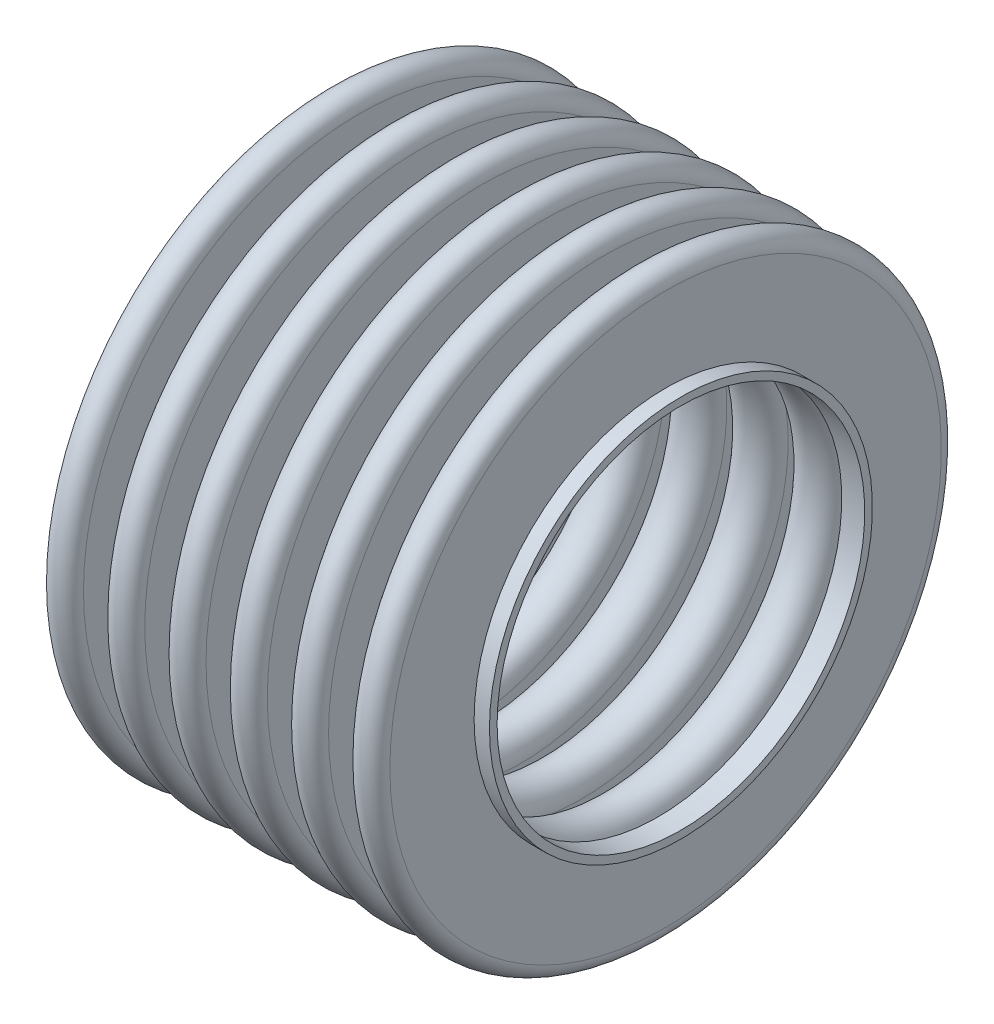
ISO-10303-21;
HEADER;
FILE_DESCRIPTION(('STEP AP214'),'2;1');
FILE_NAME('part.step','',(''),(''),'','','');
FILE_SCHEMA(('AUTOMOTIVE_DESIGN { 1 0 10303 214 1 1 1 1 }'));
ENDSEC;
DATA;
#1=APPLICATION_CONTEXT('core data for automotive mechanical design processes');
#2=APPLICATION_PROTOCOL_DEFINITION('international standard','automotive_design',2000,#1);
#3=PRODUCT_CONTEXT('',#1,'mechanical');
#4=PRODUCT('Part','Part','',(#3));
#5=PRODUCT_RELATED_PRODUCT_CATEGORY('part','',(#4));
#6=PRODUCT_DEFINITION_FORMATION('','',#4);
#7=PRODUCT_DEFINITION_CONTEXT('part definition',#1,'design');
#8=PRODUCT_DEFINITION('design','',#6,#7);
#9=PRODUCT_DEFINITION_SHAPE('','',#8);
#10=(LENGTH_UNIT() NAMED_UNIT(*) SI_UNIT(.MILLI.,.METRE.));
#11=(NAMED_UNIT(*) PLANE_ANGLE_UNIT() SI_UNIT($,.RADIAN.));
#12=(NAMED_UNIT(*) SI_UNIT($,.STERADIAN.) SOLID_ANGLE_UNIT());
#13=UNCERTAINTY_MEASURE_WITH_UNIT(LENGTH_MEASURE(1.E-05),#10,'distance_accuracy_value','');
#14=(GEOMETRIC_REPRESENTATION_CONTEXT(3) GLOBAL_UNCERTAINTY_ASSIGNED_CONTEXT((#13)) GLOBAL_UNIT_ASSIGNED_CONTEXT((#10,
#11,#12)) REPRESENTATION_CONTEXT('',''));
#15=CARTESIAN_POINT('',(0.,0.,0.));
#16=DIRECTION('',(0.,0.,1.));
#17=DIRECTION('',(1.,0.,0.));
#18=AXIS2_PLACEMENT_3D('',#15,#16,#17);
#19=CARTESIAN_POINT('',(22.,0.,0.));
#20=DIRECTION('',(-1.,0.,0.));
#21=DIRECTION('',(0.,0.,1.));
#22=AXIS2_PLACEMENT_3D('',#19,#20,#21);
#23=CYLINDRICAL_SURFACE('',#22,6.25);
#24=CARTESIAN_POINT('',(10.,0.,0.));
#25=DIRECTION('',(-1.,0.,0.));
#26=DIRECTION('',(0.,0.,1.));
#27=AXIS2_PLACEMENT_3D('',#24,#25,#26);
#28=CIRCLE('',#27,6.25);
#29=CARTESIAN_POINT('',(10.,0.,6.25));
#30=VERTEX_POINT('',#29);
#31=EDGE_CURVE('E191',#30,#30,#28,.T.);
#32=ORIENTED_EDGE('',*,*,#31,.F.);
#33=EDGE_LOOP('',(#32));
#34=FACE_BOUND('',#33,.T.);
#35=CARTESIAN_POINT('',(10.5,0.,0.));
#36=DIRECTION('',(-1.,0.,0.));
#37=DIRECTION('',(0.,0.,1.));
#38=AXIS2_PLACEMENT_3D('',#35,#36,#37);
#39=CIRCLE('',#38,6.25);
#40=CARTESIAN_POINT('',(10.5,0.,6.25));
#41=VERTEX_POINT('',#40);
#42=EDGE_CURVE('E10',#41,#41,#39,.T.);
#43=ORIENTED_EDGE('',*,*,#42,.T.);
#44=EDGE_LOOP('',(#43));
#45=FACE_BOUND('',#44,.T.);
#46=ADVANCED_FACE('F31',(#34,#45),#23,.T.);
#47=CARTESIAN_POINT('',(10.5,9.,0.));
#48=DIRECTION('',(1.,0.,0.));
#49=DIRECTION('',(0.,0.,-1.));
#50=AXIS2_PLACEMENT_3D('',#47,#48,#49);
#51=PLANE('',#50);
#52=ORIENTED_EDGE('',*,*,#42,.F.);
#53=EDGE_LOOP('',(#52));
#54=FACE_BOUND('',#53,.T.);
#55=CARTESIAN_POINT('',(10.5,0.,0.));
#56=DIRECTION('',(-1.,0.,0.));
#57=DIRECTION('',(0.,0.,1.));
#58=AXIS2_PLACEMENT_3D('',#55,#56,#57);
#59=CIRCLE('',#58,9.);
#60=CARTESIAN_POINT('',(10.5,0.,9.));
#61=VERTEX_POINT('',#60);
#62=EDGE_CURVE('E37',#61,#61,#59,.T.);
#63=ORIENTED_EDGE('',*,*,#62,.T.);
#64=EDGE_LOOP('',(#63));
#65=FACE_BOUND('',#64,.T.);
#66=ADVANCED_FACE('F198',(#54,#65),#51,.F.);
#67=CARTESIAN_POINT('',(11.,0.,0.));
#68=DIRECTION('',(-1.,0.,0.));
#69=DIRECTION('',(0.,0.,1.));
#70=AXIS2_PLACEMENT_3D('',#67,#68,#69);
#71=TOROIDAL_SURFACE('',#70,9.,0.5);
#72=ORIENTED_EDGE('',*,*,#62,.F.);
#73=EDGE_LOOP('',(#72));
#74=FACE_BOUND('',#73,.T.);
#75=CARTESIAN_POINT('',(11.5,0.,0.));
#76=DIRECTION('',(-1.,0.,0.));
#77=DIRECTION('',(0.,0.,1.));
#78=AXIS2_PLACEMENT_3D('',#75,#76,#77);
#79=CIRCLE('',#78,9.);
#80=CARTESIAN_POINT('',(11.5,0.,9.));
#81=VERTEX_POINT('',#80);
#82=EDGE_CURVE('E41',#81,#81,#79,.T.);
#83=ORIENTED_EDGE('',*,*,#82,.T.);
#84=EDGE_LOOP('',(#83));
#85=FACE_BOUND('',#84,.T.);
#86=ADVANCED_FACE('F202',(#74,#85),#71,.T.);
#87=CARTESIAN_POINT('',(11.5,6.75,0.));
#88=DIRECTION('',(-1.,0.,0.));
#89=DIRECTION('',(0.,0.,1.));
#90=AXIS2_PLACEMENT_3D('',#87,#88,#89);
#91=PLANE('',#90);
#92=ORIENTED_EDGE('',*,*,#82,.F.);
#93=EDGE_LOOP('',(#92));
#94=FACE_BOUND('',#93,.T.);
#95=CARTESIAN_POINT('',(11.5,0.,0.));
#96=DIRECTION('',(-1.,0.,0.));
#97=DIRECTION('',(0.,0.,1.));
#98=AXIS2_PLACEMENT_3D('',#95,#96,#97);
#99=CIRCLE('',#98,6.75);
#100=CARTESIAN_POINT('',(11.5,0.,6.75));
#101=VERTEX_POINT('',#100);
#102=EDGE_CURVE('E45',#101,#101,#99,.T.);
#103=ORIENTED_EDGE('',*,*,#102,.T.);
#104=EDGE_LOOP('',(#103));
#105=FACE_BOUND('',#104,.T.);
#106=ADVANCED_FACE('F207',(#94,#105),#91,.F.);
#107=CARTESIAN_POINT('',(12.,0.,0.));
#108=DIRECTION('',(-1.,0.,0.));
#109=DIRECTION('',(0.,0.,1.));
#110=AXIS2_PLACEMENT_3D('',#107,#108,#109);
#111=TOROIDAL_SURFACE('',#110,6.75,0.5);
#112=ORIENTED_EDGE('',*,*,#102,.F.);
#113=EDGE_LOOP('',(#112));
#114=FACE_BOUND('',#113,.T.);
#115=CARTESIAN_POINT('',(12.5,0.,0.));
#116=DIRECTION('',(-1.,0.,0.));
#117=DIRECTION('',(0.,0.,1.));
#118=AXIS2_PLACEMENT_3D('',#115,#116,#117);
#119=CIRCLE('',#118,6.75);
#120=CARTESIAN_POINT('',(12.5,0.,6.75));
#121=VERTEX_POINT('',#120);
#122=EDGE_CURVE('E50',#121,#121,#119,.T.);
#123=ORIENTED_EDGE('',*,*,#122,.T.);
#124=EDGE_LOOP('',(#123));
#125=FACE_BOUND('',#124,.T.);
#126=ADVANCED_FACE('F213',(#114,#125),#111,.F.);
#127=CARTESIAN_POINT('',(12.5,9.,0.));
#128=DIRECTION('',(1.,0.,0.));
#129=DIRECTION('',(0.,0.,-1.));
#130=AXIS2_PLACEMENT_3D('',#127,#128,#129);
#131=PLANE('',#130);
#132=ORIENTED_EDGE('',*,*,#122,.F.);
#133=EDGE_LOOP('',(#132));
#134=FACE_BOUND('',#133,.T.);
#135=CARTESIAN_POINT('',(12.5,0.,0.));
#136=DIRECTION('',(-1.,0.,0.));
#137=DIRECTION('',(0.,0.,1.));
#138=AXIS2_PLACEMENT_3D('',#135,#136,#137);
#139=CIRCLE('',#138,9.);
#140=CARTESIAN_POINT('',(12.5,0.,9.));
#141=VERTEX_POINT('',#140);
#142=EDGE_CURVE('E53',#141,#141,#139,.T.);
#143=ORIENTED_EDGE('',*,*,#142,.T.);
#144=EDGE_LOOP('',(#143));
#145=FACE_BOUND('',#144,.T.);
#146=ADVANCED_FACE('F217',(#134,#145),#131,.F.);
#147=CARTESIAN_POINT('',(13.,0.,0.));
#148=DIRECTION('',(-1.,0.,0.));
#149=DIRECTION('',(0.,0.,1.));
#150=AXIS2_PLACEMENT_3D('',#147,#148,#149);
#151=TOROIDAL_SURFACE('',#150,9.,0.5);
#152=ORIENTED_EDGE('',*,*,#142,.F.);
#153=EDGE_LOOP('',(#152));
#154=FACE_BOUND('',#153,.T.);
#155=CARTESIAN_POINT('',(13.5,0.,0.));
#156=DIRECTION('',(-1.,0.,0.));
#157=DIRECTION('',(0.,0.,1.));
#158=AXIS2_PLACEMENT_3D('',#155,#156,#157);
#159=CIRCLE('',#158,9.);
#160=CARTESIAN_POINT('',(13.5,0.,9.));
#161=VERTEX_POINT('',#160);
#162=EDGE_CURVE('E56',#161,#161,#159,.T.);
#163=ORIENTED_EDGE('',*,*,#162,.T.);
#164=EDGE_LOOP('',(#163));
#165=FACE_BOUND('',#164,.T.);
#166=ADVANCED_FACE('F221',(#154,#165),#151,.T.);
#167=CARTESIAN_POINT('',(13.5,6.75,0.));
#168=DIRECTION('',(-1.,0.,0.));
#169=DIRECTION('',(0.,0.,1.));
#170=AXIS2_PLACEMENT_3D('',#167,#168,#169);
#171=PLANE('',#170);
#172=ORIENTED_EDGE('',*,*,#162,.F.);
#173=EDGE_LOOP('',(#172));
#174=FACE_BOUND('',#173,.T.);
#175=CARTESIAN_POINT('',(13.5,0.,0.));
#176=DIRECTION('',(-1.,0.,0.));
#177=DIRECTION('',(0.,0.,1.));
#178=AXIS2_PLACEMENT_3D('',#175,#176,#177);
#179=CIRCLE('',#178,6.75);
#180=CARTESIAN_POINT('',(13.5,0.,6.75));
#181=VERTEX_POINT('',#180);
#182=EDGE_CURVE('E59',#181,#181,#179,.T.);
#183=ORIENTED_EDGE('',*,*,#182,.T.);
#184=EDGE_LOOP('',(#183));
#185=FACE_BOUND('',#184,.T.);
#186=ADVANCED_FACE('F225',(#174,#185),#171,.F.);
#187=CARTESIAN_POINT('',(14.,0.,0.));
#188=DIRECTION('',(-1.,0.,0.));
#189=DIRECTION('',(0.,0.,1.));
#190=AXIS2_PLACEMENT_3D('',#187,#188,#189);
#191=TOROIDAL_SURFACE('',#190,6.75,0.5);
#192=ORIENTED_EDGE('',*,*,#182,.F.);
#193=EDGE_LOOP('',(#192));
#194=FACE_BOUND('',#193,.T.);
#195=CARTESIAN_POINT('',(14.5,0.,0.));
#196=DIRECTION('',(-1.,0.,0.));
#197=DIRECTION('',(0.,0.,1.));
#198=AXIS2_PLACEMENT_3D('',#195,#196,#197);
#199=CIRCLE('',#198,6.75);
#200=CARTESIAN_POINT('',(14.5,0.,6.75));
#201=VERTEX_POINT('',#200);
#202=EDGE_CURVE('E62',#201,#201,#199,.T.);
#203=ORIENTED_EDGE('',*,*,#202,.T.);
#204=EDGE_LOOP('',(#203));
#205=FACE_BOUND('',#204,.T.);
#206=ADVANCED_FACE('F229',(#194,#205),#191,.F.);
#207=CARTESIAN_POINT('',(14.5,9.,0.));
#208=DIRECTION('',(1.,0.,0.));
#209=DIRECTION('',(0.,0.,-1.));
#210=AXIS2_PLACEMENT_3D('',#207,#208,#209);
#211=PLANE('',#210);
#212=ORIENTED_EDGE('',*,*,#202,.F.);
#213=EDGE_LOOP('',(#212));
#214=FACE_BOUND('',#213,.T.);
#215=CARTESIAN_POINT('',(14.5,0.,0.));
#216=DIRECTION('',(-1.,0.,0.));
#217=DIRECTION('',(0.,0.,1.));
#218=AXIS2_PLACEMENT_3D('',#215,#216,#217);
#219=CIRCLE('',#218,9.);
#220=CARTESIAN_POINT('',(14.5,0.,9.));
#221=VERTEX_POINT('',#220);
#222=EDGE_CURVE('E65',#221,#221,#219,.T.);
#223=ORIENTED_EDGE('',*,*,#222,.T.);
#224=EDGE_LOOP('',(#223));
#225=FACE_BOUND('',#224,.T.);
#226=ADVANCED_FACE('F233',(#214,#225),#211,.F.);
#227=CARTESIAN_POINT('',(15.,0.,0.));
#228=DIRECTION('',(-1.,0.,0.));
#229=DIRECTION('',(0.,0.,1.));
#230=AXIS2_PLACEMENT_3D('',#227,#228,#229);
#231=TOROIDAL_SURFACE('',#230,9.,0.5);
#232=ORIENTED_EDGE('',*,*,#222,.F.);
#233=EDGE_LOOP('',(#232));
#234=FACE_BOUND('',#233,.T.);
#235=CARTESIAN_POINT('',(15.5,0.,0.));
#236=DIRECTION('',(-1.,0.,0.));
#237=DIRECTION('',(0.,0.,1.));
#238=AXIS2_PLACEMENT_3D('',#235,#236,#237);
#239=CIRCLE('',#238,9.);
#240=CARTESIAN_POINT('',(15.5,0.,9.));
#241=VERTEX_POINT('',#240);
#242=EDGE_CURVE('E68',#241,#241,#239,.T.);
#243=ORIENTED_EDGE('',*,*,#242,.T.);
#244=EDGE_LOOP('',(#243));
#245=FACE_BOUND('',#244,.T.);
#246=ADVANCED_FACE('F237',(#234,#245),#231,.T.);
#247=CARTESIAN_POINT('',(15.5,6.75,0.));
#248=DIRECTION('',(-1.,0.,0.));
#249=DIRECTION('',(0.,0.,1.));
#250=AXIS2_PLACEMENT_3D('',#247,#248,#249);
#251=PLANE('',#250);
#252=ORIENTED_EDGE('',*,*,#242,.F.);
#253=EDGE_LOOP('',(#252));
#254=FACE_BOUND('',#253,.T.);
#255=CARTESIAN_POINT('',(15.5,0.,0.));
#256=DIRECTION('',(-1.,0.,0.));
#257=DIRECTION('',(0.,0.,1.));
#258=AXIS2_PLACEMENT_3D('',#255,#256,#257);
#259=CIRCLE('',#258,6.75);
#260=CARTESIAN_POINT('',(15.5,0.,6.75));
#261=VERTEX_POINT('',#260);
#262=EDGE_CURVE('E71',#261,#261,#259,.T.);
#263=ORIENTED_EDGE('',*,*,#262,.T.);
#264=EDGE_LOOP('',(#263));
#265=FACE_BOUND('',#264,.T.);
#266=ADVANCED_FACE('F241',(#254,#265),#251,.F.);
#267=CARTESIAN_POINT('',(16.,0.,0.));
#268=DIRECTION('',(-1.,0.,0.));
#269=DIRECTION('',(0.,0.,1.));
#270=AXIS2_PLACEMENT_3D('',#267,#268,#269);
#271=TOROIDAL_SURFACE('',#270,6.75,0.5);
#272=ORIENTED_EDGE('',*,*,#262,.F.);
#273=EDGE_LOOP('',(#272));
#274=FACE_BOUND('',#273,.T.);
#275=CARTESIAN_POINT('',(16.5,0.,0.));
#276=DIRECTION('',(-1.,0.,0.));
#277=DIRECTION('',(0.,0.,1.));
#278=AXIS2_PLACEMENT_3D('',#275,#276,#277);
#279=CIRCLE('',#278,6.75);
#280=CARTESIAN_POINT('',(16.5,0.,6.75));
#281=VERTEX_POINT('',#280);
#282=EDGE_CURVE('E74',#281,#281,#279,.T.);
#283=ORIENTED_EDGE('',*,*,#282,.T.);
#284=EDGE_LOOP('',(#283));
#285=FACE_BOUND('',#284,.T.);
#286=ADVANCED_FACE('F245',(#274,#285),#271,.F.);
#287=CARTESIAN_POINT('',(16.5,9.,0.));
#288=DIRECTION('',(1.,0.,0.));
#289=DIRECTION('',(0.,0.,-1.));
#290=AXIS2_PLACEMENT_3D('',#287,#288,#289);
#291=PLANE('',#290);
#292=ORIENTED_EDGE('',*,*,#282,.F.);
#293=EDGE_LOOP('',(#292));
#294=FACE_BOUND('',#293,.T.);
#295=CARTESIAN_POINT('',(16.5,0.,0.));
#296=DIRECTION('',(-1.,0.,0.));
#297=DIRECTION('',(0.,0.,1.));
#298=AXIS2_PLACEMENT_3D('',#295,#296,#297);
#299=CIRCLE('',#298,9.);
#300=CARTESIAN_POINT('',(16.5,0.,9.));
#301=VERTEX_POINT('',#300);
#302=EDGE_CURVE('E77',#301,#301,#299,.T.);
#303=ORIENTED_EDGE('',*,*,#302,.T.);
#304=EDGE_LOOP('',(#303));
#305=FACE_BOUND('',#304,.T.);
#306=ADVANCED_FACE('F249',(#294,#305),#291,.F.);
#307=CARTESIAN_POINT('',(17.,0.,0.));
#308=DIRECTION('',(-1.,0.,0.));
#309=DIRECTION('',(0.,0.,1.));
#310=AXIS2_PLACEMENT_3D('',#307,#308,#309);
#311=TOROIDAL_SURFACE('',#310,9.,0.5);
#312=ORIENTED_EDGE('',*,*,#302,.F.);
#313=EDGE_LOOP('',(#312));
#314=FACE_BOUND('',#313,.T.);
#315=CARTESIAN_POINT('',(17.5,0.,0.));
#316=DIRECTION('',(-1.,0.,0.));
#317=DIRECTION('',(0.,0.,1.));
#318=AXIS2_PLACEMENT_3D('',#315,#316,#317);
#319=CIRCLE('',#318,9.);
#320=CARTESIAN_POINT('',(17.5,0.,9.));
#321=VERTEX_POINT('',#320);
#322=EDGE_CURVE('E80',#321,#321,#319,.T.);
#323=ORIENTED_EDGE('',*,*,#322,.T.);
#324=EDGE_LOOP('',(#323));
#325=FACE_BOUND('',#324,.T.);
#326=ADVANCED_FACE('F253',(#314,#325),#311,.T.);
#327=CARTESIAN_POINT('',(17.5,6.75,0.));
#328=DIRECTION('',(-1.,0.,0.));
#329=DIRECTION('',(0.,0.,1.));
#330=AXIS2_PLACEMENT_3D('',#327,#328,#329);
#331=PLANE('',#330);
#332=ORIENTED_EDGE('',*,*,#322,.F.);
#333=EDGE_LOOP('',(#332));
#334=FACE_BOUND('',#333,.T.);
#335=CARTESIAN_POINT('',(17.5,0.,0.));
#336=DIRECTION('',(-1.,0.,0.));
#337=DIRECTION('',(0.,0.,1.));
#338=AXIS2_PLACEMENT_3D('',#335,#336,#337);
#339=CIRCLE('',#338,6.75);
#340=CARTESIAN_POINT('',(17.5,0.,6.75));
#341=VERTEX_POINT('',#340);
#342=EDGE_CURVE('E83',#341,#341,#339,.T.);
#343=ORIENTED_EDGE('',*,*,#342,.T.);
#344=EDGE_LOOP('',(#343));
#345=FACE_BOUND('',#344,.T.);
#346=ADVANCED_FACE('F257',(#334,#345),#331,.F.);
#347=CARTESIAN_POINT('',(18.,0.,0.));
#348=DIRECTION('',(-1.,0.,0.));
#349=DIRECTION('',(0.,0.,1.));
#350=AXIS2_PLACEMENT_3D('',#347,#348,#349);
#351=TOROIDAL_SURFACE('',#350,6.75,0.499999999999999);
#352=ORIENTED_EDGE('',*,*,#342,.F.);
#353=EDGE_LOOP('',(#352));
#354=FACE_BOUND('',#353,.T.);
#355=CARTESIAN_POINT('',(18.5,0.,0.));
#356=DIRECTION('',(-1.,0.,0.));
#357=DIRECTION('',(0.,0.,1.));
#358=AXIS2_PLACEMENT_3D('',#355,#356,#357);
#359=CIRCLE('',#358,6.75);
#360=CARTESIAN_POINT('',(18.5,0.,6.75));
#361=VERTEX_POINT('',#360);
#362=EDGE_CURVE('E86',#361,#361,#359,.T.);
#363=ORIENTED_EDGE('',*,*,#362,.T.);
#364=EDGE_LOOP('',(#363));
#365=FACE_BOUND('',#364,.T.);
#366=ADVANCED_FACE('F261',(#354,#365),#351,.F.);
#367=CARTESIAN_POINT('',(18.5,9.,0.));
#368=DIRECTION('',(1.,0.,0.));
#369=DIRECTION('',(0.,0.,-1.));
#370=AXIS2_PLACEMENT_3D('',#367,#368,#369);
#371=PLANE('',#370);
#372=ORIENTED_EDGE('',*,*,#362,.F.);
#373=EDGE_LOOP('',(#372));
#374=FACE_BOUND('',#373,.T.);
#375=CARTESIAN_POINT('',(18.5,0.,0.));
#376=DIRECTION('',(-1.,0.,0.));
#377=DIRECTION('',(0.,0.,1.));
#378=AXIS2_PLACEMENT_3D('',#375,#376,#377);
#379=CIRCLE('',#378,9.);
#380=CARTESIAN_POINT('',(18.5,0.,9.));
#381=VERTEX_POINT('',#380);
#382=EDGE_CURVE('E89',#381,#381,#379,.T.);
#383=ORIENTED_EDGE('',*,*,#382,.T.);
#384=EDGE_LOOP('',(#383));
#385=FACE_BOUND('',#384,.T.);
#386=ADVANCED_FACE('F265',(#374,#385),#371,.F.);
#387=CARTESIAN_POINT('',(19.,0.,0.));
#388=DIRECTION('',(-1.,0.,0.));
#389=DIRECTION('',(0.,0.,1.));
#390=AXIS2_PLACEMENT_3D('',#387,#388,#389);
#391=TOROIDAL_SURFACE('',#390,9.,0.5);
#392=ORIENTED_EDGE('',*,*,#382,.F.);
#393=EDGE_LOOP('',(#392));
#394=FACE_BOUND('',#393,.T.);
#395=CARTESIAN_POINT('',(19.5,0.,0.));
#396=DIRECTION('',(-1.,0.,0.));
#397=DIRECTION('',(0.,0.,1.));
#398=AXIS2_PLACEMENT_3D('',#395,#396,#397);
#399=CIRCLE('',#398,9.);
#400=CARTESIAN_POINT('',(19.5,0.,9.));
#401=VERTEX_POINT('',#400);
#402=EDGE_CURVE('E92',#401,#401,#399,.T.);
#403=ORIENTED_EDGE('',*,*,#402,.T.);
#404=EDGE_LOOP('',(#403));
#405=FACE_BOUND('',#404,.T.);
#406=ADVANCED_FACE('F269',(#394,#405),#391,.T.);
#407=CARTESIAN_POINT('',(19.5,6.75,0.));
#408=DIRECTION('',(-1.,0.,0.));
#409=DIRECTION('',(0.,0.,1.));
#410=AXIS2_PLACEMENT_3D('',#407,#408,#409);
#411=PLANE('',#410);
#412=ORIENTED_EDGE('',*,*,#402,.F.);
#413=EDGE_LOOP('',(#412));
#414=FACE_BOUND('',#413,.T.);
#415=CARTESIAN_POINT('',(19.5,0.,0.));
#416=DIRECTION('',(-1.,0.,0.));
#417=DIRECTION('',(0.,0.,1.));
#418=AXIS2_PLACEMENT_3D('',#415,#416,#417);
#419=CIRCLE('',#418,6.75);
#420=CARTESIAN_POINT('',(19.5,0.,6.75));
#421=VERTEX_POINT('',#420);
#422=EDGE_CURVE('E95',#421,#421,#419,.T.);
#423=ORIENTED_EDGE('',*,*,#422,.T.);
#424=EDGE_LOOP('',(#423));
#425=FACE_BOUND('',#424,.T.);
#426=ADVANCED_FACE('F273',(#414,#425),#411,.F.);
#427=CARTESIAN_POINT('',(20.,0.,0.));
#428=DIRECTION('',(-1.,0.,0.));
#429=DIRECTION('',(0.,0.,1.));
#430=AXIS2_PLACEMENT_3D('',#427,#428,#429);
#431=TOROIDAL_SURFACE('',#430,6.75,0.5);
#432=ORIENTED_EDGE('',*,*,#422,.F.);
#433=EDGE_LOOP('',(#432));
#434=FACE_BOUND('',#433,.T.);
#435=CARTESIAN_POINT('',(20.5,0.,0.));
#436=DIRECTION('',(-1.,0.,0.));
#437=DIRECTION('',(0.,0.,1.));
#438=AXIS2_PLACEMENT_3D('',#435,#436,#437);
#439=CIRCLE('',#438,6.75);
#440=CARTESIAN_POINT('',(20.5,0.,6.75));
#441=VERTEX_POINT('',#440);
#442=EDGE_CURVE('E98',#441,#441,#439,.T.);
#443=ORIENTED_EDGE('',*,*,#442,.T.);
#444=EDGE_LOOP('',(#443));
#445=FACE_BOUND('',#444,.T.);
#446=ADVANCED_FACE('F277',(#434,#445),#431,.F.);
#447=CARTESIAN_POINT('',(20.5,9.,0.));
#448=DIRECTION('',(1.,0.,0.));
#449=DIRECTION('',(0.,0.,-1.));
#450=AXIS2_PLACEMENT_3D('',#447,#448,#449);
#451=PLANE('',#450);
#452=ORIENTED_EDGE('',*,*,#442,.F.);
#453=EDGE_LOOP('',(#452));
#454=FACE_BOUND('',#453,.T.);
#455=CARTESIAN_POINT('',(20.5,0.,0.));
#456=DIRECTION('',(-1.,0.,0.));
#457=DIRECTION('',(0.,0.,1.));
#458=AXIS2_PLACEMENT_3D('',#455,#456,#457);
#459=CIRCLE('',#458,9.);
#460=CARTESIAN_POINT('',(20.5,0.,9.));
#461=VERTEX_POINT('',#460);
#462=EDGE_CURVE('E101',#461,#461,#459,.T.);
#463=ORIENTED_EDGE('',*,*,#462,.T.);
#464=EDGE_LOOP('',(#463));
#465=FACE_BOUND('',#464,.T.);
#466=ADVANCED_FACE('F281',(#454,#465),#451,.F.);
#467=CARTESIAN_POINT('',(21.,0.,0.));
#468=DIRECTION('',(-1.,0.,0.));
#469=DIRECTION('',(0.,0.,1.));
#470=AXIS2_PLACEMENT_3D('',#467,#468,#469);
#471=TOROIDAL_SURFACE('',#470,9.,0.499999999999999);
#472=ORIENTED_EDGE('',*,*,#462,.F.);
#473=EDGE_LOOP('',(#472));
#474=FACE_BOUND('',#473,.T.);
#475=CARTESIAN_POINT('',(21.5,0.,0.));
#476=DIRECTION('',(-1.,0.,0.));
#477=DIRECTION('',(0.,0.,1.));
#478=AXIS2_PLACEMENT_3D('',#475,#476,#477);
#479=CIRCLE('',#478,9.);
#480=CARTESIAN_POINT('',(21.5,0.,9.));
#481=VERTEX_POINT('',#480);
#482=EDGE_CURVE('E104',#481,#481,#479,.T.);
#483=ORIENTED_EDGE('',*,*,#482,.T.);
#484=EDGE_LOOP('',(#483));
#485=FACE_BOUND('',#484,.T.);
#486=ADVANCED_FACE('F285',(#474,#485),#471,.T.);
#487=CARTESIAN_POINT('',(21.5,6.25,0.));
#488=DIRECTION('',(-1.,0.,0.));
#489=DIRECTION('',(0.,0.,1.));
#490=AXIS2_PLACEMENT_3D('',#487,#488,#489);
#491=PLANE('',#490);
#492=ORIENTED_EDGE('',*,*,#482,.F.);
#493=EDGE_LOOP('',(#492));
#494=FACE_BOUND('',#493,.T.);
#495=CARTESIAN_POINT('',(21.5,0.,0.));
#496=DIRECTION('',(-1.,0.,0.));
#497=DIRECTION('',(0.,0.,1.));
#498=AXIS2_PLACEMENT_3D('',#495,#496,#497);
#499=CIRCLE('',#498,6.25);
#500=CARTESIAN_POINT('',(21.5,0.,6.25));
#501=VERTEX_POINT('',#500);
#502=EDGE_CURVE('E107',#501,#501,#499,.T.);
#503=ORIENTED_EDGE('',*,*,#502,.T.);
#504=EDGE_LOOP('',(#503));
#505=FACE_BOUND('',#504,.T.);
#506=ADVANCED_FACE('F289',(#494,#505),#491,.F.);
#507=CARTESIAN_POINT('',(22.,0.,0.));
#508=DIRECTION('',(-1.,0.,0.));
#509=DIRECTION('',(0.,0.,1.));
#510=AXIS2_PLACEMENT_3D('',#507,#508,#509);
#511=CYLINDRICAL_SURFACE('',#510,6.25);
#512=ORIENTED_EDGE('',*,*,#502,.F.);
#513=EDGE_LOOP('',(#512));
#514=FACE_BOUND('',#513,.T.);
#515=CARTESIAN_POINT('',(22.,0.,0.));
#516=DIRECTION('',(-1.,0.,0.));
#517=DIRECTION('',(0.,0.,1.));
#518=AXIS2_PLACEMENT_3D('',#515,#516,#517);
#519=CIRCLE('',#518,6.25);
#520=CARTESIAN_POINT('',(22.,0.,6.25));
#521=VERTEX_POINT('',#520);
#522=EDGE_CURVE('E110',#521,#521,#519,.T.);
#523=ORIENTED_EDGE('',*,*,#522,.T.);
#524=EDGE_LOOP('',(#523));
#525=FACE_BOUND('',#524,.T.);
#526=ADVANCED_FACE('F293',(#514,#525),#511,.T.);
#527=CARTESIAN_POINT('',(22.,6.,0.));
#528=DIRECTION('',(-1.,0.,0.));
#529=DIRECTION('',(0.,0.,1.));
#530=AXIS2_PLACEMENT_3D('',#527,#528,#529);
#531=PLANE('',#530);
#532=ORIENTED_EDGE('',*,*,#522,.F.);
#533=EDGE_LOOP('',(#532));
#534=FACE_BOUND('',#533,.T.);
#535=CARTESIAN_POINT('',(22.,0.,0.));
#536=DIRECTION('',(-1.,0.,0.));
#537=DIRECTION('',(0.,0.,1.));
#538=AXIS2_PLACEMENT_3D('',#535,#536,#537);
#539=CIRCLE('',#538,6.);
#540=CARTESIAN_POINT('',(22.,0.,6.));
#541=VERTEX_POINT('',#540);
#542=EDGE_CURVE('E113',#541,#541,#539,.T.);
#543=ORIENTED_EDGE('',*,*,#542,.T.);
#544=EDGE_LOOP('',(#543));
#545=FACE_BOUND('',#544,.T.);
#546=ADVANCED_FACE('F297',(#534,#545),#531,.F.);
#547=CARTESIAN_POINT('',(22.,0.,0.));
#548=DIRECTION('',(-1.,0.,0.));
#549=DIRECTION('',(0.,0.,1.));
#550=AXIS2_PLACEMENT_3D('',#547,#548,#549);
#551=CYLINDRICAL_SURFACE('',#550,6.);
#552=ORIENTED_EDGE('',*,*,#542,.F.);
#553=EDGE_LOOP('',(#552));
#554=FACE_BOUND('',#553,.T.);
#555=CARTESIAN_POINT('',(21.25,0.,0.));
#556=DIRECTION('',(-1.,0.,0.));
#557=DIRECTION('',(0.,0.,1.));
#558=AXIS2_PLACEMENT_3D('',#555,#556,#557);
#559=CIRCLE('',#558,6.);
#560=CARTESIAN_POINT('',(21.25,0.,6.));
#561=VERTEX_POINT('',#560);
#562=EDGE_CURVE('E116',#561,#561,#559,.T.);
#563=ORIENTED_EDGE('',*,*,#562,.T.);
#564=EDGE_LOOP('',(#563));
#565=FACE_BOUND('',#564,.T.);
#566=ADVANCED_FACE('F301',(#554,#565),#551,.F.);
#567=CARTESIAN_POINT('',(21.25,9.,0.));
#568=DIRECTION('',(1.,0.,0.));
#569=DIRECTION('',(0.,0.,-1.));
#570=AXIS2_PLACEMENT_3D('',#567,#568,#569);
#571=PLANE('',#570);
#572=ORIENTED_EDGE('',*,*,#562,.F.);
#573=EDGE_LOOP('',(#572));
#574=FACE_BOUND('',#573,.T.);
#575=CARTESIAN_POINT('',(21.25,0.,0.));
#576=DIRECTION('',(-1.,0.,0.));
#577=DIRECTION('',(0.,0.,1.));
#578=AXIS2_PLACEMENT_3D('',#575,#576,#577);
#579=CIRCLE('',#578,9.);
#580=CARTESIAN_POINT('',(21.25,0.,9.));
#581=VERTEX_POINT('',#580);
#582=EDGE_CURVE('E119',#581,#581,#579,.T.);
#583=ORIENTED_EDGE('',*,*,#582,.T.);
#584=EDGE_LOOP('',(#583));
#585=FACE_BOUND('',#584,.T.);
#586=ADVANCED_FACE('F305',(#574,#585),#571,.F.);
#587=CARTESIAN_POINT('',(21.,0.,0.));
#588=DIRECTION('',(-1.,0.,0.));
#589=DIRECTION('',(0.,0.,1.));
#590=AXIS2_PLACEMENT_3D('',#587,#588,#589);
#591=TOROIDAL_SURFACE('',#590,9.,0.25);
#592=ORIENTED_EDGE('',*,*,#582,.F.);
#593=EDGE_LOOP('',(#592));
#594=FACE_BOUND('',#593,.T.);
#595=CARTESIAN_POINT('',(20.75,0.,0.));
#596=DIRECTION('',(-1.,0.,0.));
#597=DIRECTION('',(0.,0.,1.));
#598=AXIS2_PLACEMENT_3D('',#595,#596,#597);
#599=CIRCLE('',#598,9.);
#600=CARTESIAN_POINT('',(20.75,0.,9.));
#601=VERTEX_POINT('',#600);
#602=EDGE_CURVE('E122',#601,#601,#599,.T.);
#603=ORIENTED_EDGE('',*,*,#602,.T.);
#604=EDGE_LOOP('',(#603));
#605=FACE_BOUND('',#604,.T.);
#606=ADVANCED_FACE('F309',(#594,#605),#591,.F.);
#607=CARTESIAN_POINT('',(20.75,6.75,0.));
#608=DIRECTION('',(-1.,0.,0.));
#609=DIRECTION('',(0.,0.,1.));
#610=AXIS2_PLACEMENT_3D('',#607,#608,#609);
#611=PLANE('',#610);
#612=ORIENTED_EDGE('',*,*,#602,.F.);
#613=EDGE_LOOP('',(#612));
#614=FACE_BOUND('',#613,.T.);
#615=CARTESIAN_POINT('',(20.75,0.,0.));
#616=DIRECTION('',(-1.,0.,0.));
#617=DIRECTION('',(0.,0.,1.));
#618=AXIS2_PLACEMENT_3D('',#615,#616,#617);
#619=CIRCLE('',#618,6.75);
#620=CARTESIAN_POINT('',(20.75,0.,6.75));
#621=VERTEX_POINT('',#620);
#622=EDGE_CURVE('E125',#621,#621,#619,.T.);
#623=ORIENTED_EDGE('',*,*,#622,.T.);
#624=EDGE_LOOP('',(#623));
#625=FACE_BOUND('',#624,.T.);
#626=ADVANCED_FACE('F313',(#614,#625),#611,.F.);
#627=CARTESIAN_POINT('',(20.,0.,0.));
#628=DIRECTION('',(-1.,0.,0.));
#629=DIRECTION('',(0.,0.,1.));
#630=AXIS2_PLACEMENT_3D('',#627,#628,#629);
#631=TOROIDAL_SURFACE('',#630,6.75,0.750000000000001);
#632=ORIENTED_EDGE('',*,*,#622,.F.);
#633=EDGE_LOOP('',(#632));
#634=FACE_BOUND('',#633,.T.);
#635=CARTESIAN_POINT('',(19.25,0.,0.));
#636=DIRECTION('',(-1.,0.,0.));
#637=DIRECTION('',(0.,0.,1.));
#638=AXIS2_PLACEMENT_3D('',#635,#636,#637);
#639=CIRCLE('',#638,6.75);
#640=CARTESIAN_POINT('',(19.25,0.,6.75));
#641=VERTEX_POINT('',#640);
#642=EDGE_CURVE('E128',#641,#641,#639,.T.);
#643=ORIENTED_EDGE('',*,*,#642,.T.);
#644=EDGE_LOOP('',(#643));
#645=FACE_BOUND('',#644,.T.);
#646=ADVANCED_FACE('F317',(#634,#645),#631,.T.);
#647=CARTESIAN_POINT('',(19.25,9.,0.));
#648=DIRECTION('',(1.,0.,0.));
#649=DIRECTION('',(0.,0.,-1.));
#650=AXIS2_PLACEMENT_3D('',#647,#648,#649);
#651=PLANE('',#650);
#652=ORIENTED_EDGE('',*,*,#642,.F.);
#653=EDGE_LOOP('',(#652));
#654=FACE_BOUND('',#653,.T.);
#655=CARTESIAN_POINT('',(19.25,0.,0.));
#656=DIRECTION('',(-1.,0.,0.));
#657=DIRECTION('',(0.,0.,1.));
#658=AXIS2_PLACEMENT_3D('',#655,#656,#657);
#659=CIRCLE('',#658,9.);
#660=CARTESIAN_POINT('',(19.25,0.,9.));
#661=VERTEX_POINT('',#660);
#662=EDGE_CURVE('E131',#661,#661,#659,.T.);
#663=ORIENTED_EDGE('',*,*,#662,.T.);
#664=EDGE_LOOP('',(#663));
#665=FACE_BOUND('',#664,.T.);
#666=ADVANCED_FACE('F321',(#654,#665),#651,.F.);
#667=CARTESIAN_POINT('',(19.,0.,0.));
#668=DIRECTION('',(-1.,0.,0.));
#669=DIRECTION('',(0.,0.,1.));
#670=AXIS2_PLACEMENT_3D('',#667,#668,#669);
#671=TOROIDAL_SURFACE('',#670,9.,0.25);
#672=ORIENTED_EDGE('',*,*,#662,.F.);
#673=EDGE_LOOP('',(#672));
#674=FACE_BOUND('',#673,.T.);
#675=CARTESIAN_POINT('',(18.75,0.,0.));
#676=DIRECTION('',(-1.,0.,0.));
#677=DIRECTION('',(0.,0.,1.));
#678=AXIS2_PLACEMENT_3D('',#675,#676,#677);
#679=CIRCLE('',#678,9.);
#680=CARTESIAN_POINT('',(18.75,0.,9.));
#681=VERTEX_POINT('',#680);
#682=EDGE_CURVE('E134',#681,#681,#679,.T.);
#683=ORIENTED_EDGE('',*,*,#682,.T.);
#684=EDGE_LOOP('',(#683));
#685=FACE_BOUND('',#684,.T.);
#686=ADVANCED_FACE('F325',(#674,#685),#671,.F.);
#687=CARTESIAN_POINT('',(18.75,6.75,0.));
#688=DIRECTION('',(-1.,0.,0.));
#689=DIRECTION('',(0.,0.,1.));
#690=AXIS2_PLACEMENT_3D('',#687,#688,#689);
#691=PLANE('',#690);
#692=ORIENTED_EDGE('',*,*,#682,.F.);
#693=EDGE_LOOP('',(#692));
#694=FACE_BOUND('',#693,.T.);
#695=CARTESIAN_POINT('',(18.75,0.,0.));
#696=DIRECTION('',(-1.,0.,0.));
#697=DIRECTION('',(0.,0.,1.));
#698=AXIS2_PLACEMENT_3D('',#695,#696,#697);
#699=CIRCLE('',#698,6.75);
#700=CARTESIAN_POINT('',(18.75,0.,6.75));
#701=VERTEX_POINT('',#700);
#702=EDGE_CURVE('E137',#701,#701,#699,.T.);
#703=ORIENTED_EDGE('',*,*,#702,.T.);
#704=EDGE_LOOP('',(#703));
#705=FACE_BOUND('',#704,.T.);
#706=ADVANCED_FACE('F329',(#694,#705),#691,.F.);
#707=CARTESIAN_POINT('',(18.,0.,0.));
#708=DIRECTION('',(-1.,0.,0.));
#709=DIRECTION('',(0.,0.,1.));
#710=AXIS2_PLACEMENT_3D('',#707,#708,#709);
#711=TOROIDAL_SURFACE('',#710,6.75,0.749999999999999);
#712=ORIENTED_EDGE('',*,*,#702,.F.);
#713=EDGE_LOOP('',(#712));
#714=FACE_BOUND('',#713,.T.);
#715=CARTESIAN_POINT('',(17.25,0.,0.));
#716=DIRECTION('',(-1.,0.,0.));
#717=DIRECTION('',(0.,0.,1.));
#718=AXIS2_PLACEMENT_3D('',#715,#716,#717);
#719=CIRCLE('',#718,6.75);
#720=CARTESIAN_POINT('',(17.25,0.,6.75));
#721=VERTEX_POINT('',#720);
#722=EDGE_CURVE('E140',#721,#721,#719,.T.);
#723=ORIENTED_EDGE('',*,*,#722,.T.);
#724=EDGE_LOOP('',(#723));
#725=FACE_BOUND('',#724,.T.);
#726=ADVANCED_FACE('F333',(#714,#725),#711,.T.);
#727=CARTESIAN_POINT('',(17.25,9.,0.));
#728=DIRECTION('',(1.,0.,0.));
#729=DIRECTION('',(0.,0.,-1.));
#730=AXIS2_PLACEMENT_3D('',#727,#728,#729);
#731=PLANE('',#730);
#732=ORIENTED_EDGE('',*,*,#722,.F.);
#733=EDGE_LOOP('',(#732));
#734=FACE_BOUND('',#733,.T.);
#735=CARTESIAN_POINT('',(17.25,0.,0.));
#736=DIRECTION('',(-1.,0.,0.));
#737=DIRECTION('',(0.,0.,1.));
#738=AXIS2_PLACEMENT_3D('',#735,#736,#737);
#739=CIRCLE('',#738,9.);
#740=CARTESIAN_POINT('',(17.25,0.,9.));
#741=VERTEX_POINT('',#740);
#742=EDGE_CURVE('E143',#741,#741,#739,.T.);
#743=ORIENTED_EDGE('',*,*,#742,.T.);
#744=EDGE_LOOP('',(#743));
#745=FACE_BOUND('',#744,.T.);
#746=ADVANCED_FACE('F337',(#734,#745),#731,.F.);
#747=CARTESIAN_POINT('',(17.,0.,0.));
#748=DIRECTION('',(-1.,0.,0.));
#749=DIRECTION('',(0.,0.,1.));
#750=AXIS2_PLACEMENT_3D('',#747,#748,#749);
#751=TOROIDAL_SURFACE('',#750,9.,0.25);
#752=ORIENTED_EDGE('',*,*,#742,.F.);
#753=EDGE_LOOP('',(#752));
#754=FACE_BOUND('',#753,.T.);
#755=CARTESIAN_POINT('',(16.75,0.,0.));
#756=DIRECTION('',(-1.,0.,0.));
#757=DIRECTION('',(0.,0.,1.));
#758=AXIS2_PLACEMENT_3D('',#755,#756,#757);
#759=CIRCLE('',#758,9.);
#760=CARTESIAN_POINT('',(16.75,0.,9.));
#761=VERTEX_POINT('',#760);
#762=EDGE_CURVE('E146',#761,#761,#759,.T.);
#763=ORIENTED_EDGE('',*,*,#762,.T.);
#764=EDGE_LOOP('',(#763));
#765=FACE_BOUND('',#764,.T.);
#766=ADVANCED_FACE('F341',(#754,#765),#751,.F.);
#767=CARTESIAN_POINT('',(16.75,6.75,0.));
#768=DIRECTION('',(-1.,0.,0.));
#769=DIRECTION('',(0.,0.,1.));
#770=AXIS2_PLACEMENT_3D('',#767,#768,#769);
#771=PLANE('',#770);
#772=ORIENTED_EDGE('',*,*,#762,.F.);
#773=EDGE_LOOP('',(#772));
#774=FACE_BOUND('',#773,.T.);
#775=CARTESIAN_POINT('',(16.75,0.,0.));
#776=DIRECTION('',(-1.,0.,0.));
#777=DIRECTION('',(0.,0.,1.));
#778=AXIS2_PLACEMENT_3D('',#775,#776,#777);
#779=CIRCLE('',#778,6.75);
#780=CARTESIAN_POINT('',(16.75,0.,6.75));
#781=VERTEX_POINT('',#780);
#782=EDGE_CURVE('E149',#781,#781,#779,.T.);
#783=ORIENTED_EDGE('',*,*,#782,.T.);
#784=EDGE_LOOP('',(#783));
#785=FACE_BOUND('',#784,.T.);
#786=ADVANCED_FACE('F345',(#774,#785),#771,.F.);
#787=CARTESIAN_POINT('',(16.,0.,0.));
#788=DIRECTION('',(-1.,0.,0.));
#789=DIRECTION('',(0.,0.,1.));
#790=AXIS2_PLACEMENT_3D('',#787,#788,#789);
#791=TOROIDAL_SURFACE('',#790,6.75,0.750000000000001);
#792=ORIENTED_EDGE('',*,*,#782,.F.);
#793=EDGE_LOOP('',(#792));
#794=FACE_BOUND('',#793,.T.);
#795=CARTESIAN_POINT('',(15.25,0.,0.));
#796=DIRECTION('',(-1.,0.,0.));
#797=DIRECTION('',(0.,0.,1.));
#798=AXIS2_PLACEMENT_3D('',#795,#796,#797);
#799=CIRCLE('',#798,6.75);
#800=CARTESIAN_POINT('',(15.25,0.,6.75));
#801=VERTEX_POINT('',#800);
#802=EDGE_CURVE('E152',#801,#801,#799,.T.);
#803=ORIENTED_EDGE('',*,*,#802,.T.);
#804=EDGE_LOOP('',(#803));
#805=FACE_BOUND('',#804,.T.);
#806=ADVANCED_FACE('F349',(#794,#805),#791,.T.);
#807=CARTESIAN_POINT('',(15.25,9.,0.));
#808=DIRECTION('',(1.,0.,0.));
#809=DIRECTION('',(0.,0.,-1.));
#810=AXIS2_PLACEMENT_3D('',#807,#808,#809);
#811=PLANE('',#810);
#812=ORIENTED_EDGE('',*,*,#802,.F.);
#813=EDGE_LOOP('',(#812));
#814=FACE_BOUND('',#813,.T.);
#815=CARTESIAN_POINT('',(15.25,0.,0.));
#816=DIRECTION('',(-1.,0.,0.));
#817=DIRECTION('',(0.,0.,1.));
#818=AXIS2_PLACEMENT_3D('',#815,#816,#817);
#819=CIRCLE('',#818,9.);
#820=CARTESIAN_POINT('',(15.25,0.,9.));
#821=VERTEX_POINT('',#820);
#822=EDGE_CURVE('E155',#821,#821,#819,.T.);
#823=ORIENTED_EDGE('',*,*,#822,.T.);
#824=EDGE_LOOP('',(#823));
#825=FACE_BOUND('',#824,.T.);
#826=ADVANCED_FACE('F353',(#814,#825),#811,.F.);
#827=CARTESIAN_POINT('',(15.,0.,0.));
#828=DIRECTION('',(-1.,0.,0.));
#829=DIRECTION('',(0.,0.,1.));
#830=AXIS2_PLACEMENT_3D('',#827,#828,#829);
#831=TOROIDAL_SURFACE('',#830,9.,0.25);
#832=ORIENTED_EDGE('',*,*,#822,.F.);
#833=EDGE_LOOP('',(#832));
#834=FACE_BOUND('',#833,.T.);
#835=CARTESIAN_POINT('',(14.75,0.,0.));
#836=DIRECTION('',(-1.,0.,0.));
#837=DIRECTION('',(0.,0.,1.));
#838=AXIS2_PLACEMENT_3D('',#835,#836,#837);
#839=CIRCLE('',#838,9.);
#840=CARTESIAN_POINT('',(14.75,0.,9.));
#841=VERTEX_POINT('',#840);
#842=EDGE_CURVE('E158',#841,#841,#839,.T.);
#843=ORIENTED_EDGE('',*,*,#842,.T.);
#844=EDGE_LOOP('',(#843));
#845=FACE_BOUND('',#844,.T.);
#846=ADVANCED_FACE('F357',(#834,#845),#831,.F.);
#847=CARTESIAN_POINT('',(14.75,6.75,0.));
#848=DIRECTION('',(-1.,0.,0.));
#849=DIRECTION('',(0.,0.,1.));
#850=AXIS2_PLACEMENT_3D('',#847,#848,#849);
#851=PLANE('',#850);
#852=ORIENTED_EDGE('',*,*,#842,.F.);
#853=EDGE_LOOP('',(#852));
#854=FACE_BOUND('',#853,.T.);
#855=CARTESIAN_POINT('',(14.75,0.,0.));
#856=DIRECTION('',(-1.,0.,0.));
#857=DIRECTION('',(0.,0.,1.));
#858=AXIS2_PLACEMENT_3D('',#855,#856,#857);
#859=CIRCLE('',#858,6.75);
#860=CARTESIAN_POINT('',(14.75,0.,6.75));
#861=VERTEX_POINT('',#860);
#862=EDGE_CURVE('E161',#861,#861,#859,.T.);
#863=ORIENTED_EDGE('',*,*,#862,.T.);
#864=EDGE_LOOP('',(#863));
#865=FACE_BOUND('',#864,.T.);
#866=ADVANCED_FACE('F361',(#854,#865),#851,.F.);
#867=CARTESIAN_POINT('',(14.,0.,0.));
#868=DIRECTION('',(-1.,0.,0.));
#869=DIRECTION('',(0.,0.,1.));
#870=AXIS2_PLACEMENT_3D('',#867,#868,#869);
#871=TOROIDAL_SURFACE('',#870,6.75,0.75);
#872=ORIENTED_EDGE('',*,*,#862,.F.);
#873=EDGE_LOOP('',(#872));
#874=FACE_BOUND('',#873,.T.);
#875=CARTESIAN_POINT('',(13.25,0.,0.));
#876=DIRECTION('',(-1.,0.,0.));
#877=DIRECTION('',(0.,0.,1.));
#878=AXIS2_PLACEMENT_3D('',#875,#876,#877);
#879=CIRCLE('',#878,6.75);
#880=CARTESIAN_POINT('',(13.25,0.,6.75));
#881=VERTEX_POINT('',#880);
#882=EDGE_CURVE('E164',#881,#881,#879,.T.);
#883=ORIENTED_EDGE('',*,*,#882,.T.);
#884=EDGE_LOOP('',(#883));
#885=FACE_BOUND('',#884,.T.);
#886=ADVANCED_FACE('F365',(#874,#885),#871,.T.);
#887=CARTESIAN_POINT('',(13.25,9.,0.));
#888=DIRECTION('',(1.,0.,0.));
#889=DIRECTION('',(0.,0.,-1.));
#890=AXIS2_PLACEMENT_3D('',#887,#888,#889);
#891=PLANE('',#890);
#892=ORIENTED_EDGE('',*,*,#882,.F.);
#893=EDGE_LOOP('',(#892));
#894=FACE_BOUND('',#893,.T.);
#895=CARTESIAN_POINT('',(13.25,0.,0.));
#896=DIRECTION('',(-1.,0.,0.));
#897=DIRECTION('',(0.,0.,1.));
#898=AXIS2_PLACEMENT_3D('',#895,#896,#897);
#899=CIRCLE('',#898,9.);
#900=CARTESIAN_POINT('',(13.25,0.,9.));
#901=VERTEX_POINT('',#900);
#902=EDGE_CURVE('E167',#901,#901,#899,.T.);
#903=ORIENTED_EDGE('',*,*,#902,.T.);
#904=EDGE_LOOP('',(#903));
#905=FACE_BOUND('',#904,.T.);
#906=ADVANCED_FACE('F369',(#894,#905),#891,.F.);
#907=CARTESIAN_POINT('',(13.,0.,0.));
#908=DIRECTION('',(-1.,0.,0.));
#909=DIRECTION('',(0.,0.,1.));
#910=AXIS2_PLACEMENT_3D('',#907,#908,#909);
#911=TOROIDAL_SURFACE('',#910,9.,0.25);
#912=ORIENTED_EDGE('',*,*,#902,.F.);
#913=EDGE_LOOP('',(#912));
#914=FACE_BOUND('',#913,.T.);
#915=CARTESIAN_POINT('',(12.75,0.,0.));
#916=DIRECTION('',(-1.,0.,0.));
#917=DIRECTION('',(0.,0.,1.));
#918=AXIS2_PLACEMENT_3D('',#915,#916,#917);
#919=CIRCLE('',#918,9.);
#920=CARTESIAN_POINT('',(12.75,0.,9.));
#921=VERTEX_POINT('',#920);
#922=EDGE_CURVE('E170',#921,#921,#919,.T.);
#923=ORIENTED_EDGE('',*,*,#922,.T.);
#924=EDGE_LOOP('',(#923));
#925=FACE_BOUND('',#924,.T.);
#926=ADVANCED_FACE('F373',(#914,#925),#911,.F.);
#927=CARTESIAN_POINT('',(12.75,6.75,0.));
#928=DIRECTION('',(-1.,0.,0.));
#929=DIRECTION('',(0.,0.,1.));
#930=AXIS2_PLACEMENT_3D('',#927,#928,#929);
#931=PLANE('',#930);
#932=ORIENTED_EDGE('',*,*,#922,.F.);
#933=EDGE_LOOP('',(#932));
#934=FACE_BOUND('',#933,.T.);
#935=CARTESIAN_POINT('',(12.75,0.,0.));
#936=DIRECTION('',(-1.,0.,0.));
#937=DIRECTION('',(0.,0.,1.));
#938=AXIS2_PLACEMENT_3D('',#935,#936,#937);
#939=CIRCLE('',#938,6.75);
#940=CARTESIAN_POINT('',(12.75,0.,6.75));
#941=VERTEX_POINT('',#940);
#942=EDGE_CURVE('E173',#941,#941,#939,.T.);
#943=ORIENTED_EDGE('',*,*,#942,.T.);
#944=EDGE_LOOP('',(#943));
#945=FACE_BOUND('',#944,.T.);
#946=ADVANCED_FACE('F377',(#934,#945),#931,.F.);
#947=CARTESIAN_POINT('',(12.,0.,0.));
#948=DIRECTION('',(-1.,0.,0.));
#949=DIRECTION('',(0.,0.,1.));
#950=AXIS2_PLACEMENT_3D('',#947,#948,#949);
#951=TOROIDAL_SURFACE('',#950,6.75,0.75);
#952=ORIENTED_EDGE('',*,*,#942,.F.);
#953=EDGE_LOOP('',(#952));
#954=FACE_BOUND('',#953,.T.);
#955=CARTESIAN_POINT('',(11.25,0.,0.));
#956=DIRECTION('',(-1.,0.,0.));
#957=DIRECTION('',(0.,0.,1.));
#958=AXIS2_PLACEMENT_3D('',#955,#956,#957);
#959=CIRCLE('',#958,6.75);
#960=CARTESIAN_POINT('',(11.25,0.,6.75));
#961=VERTEX_POINT('',#960);
#962=EDGE_CURVE('E176',#961,#961,#959,.T.);
#963=ORIENTED_EDGE('',*,*,#962,.T.);
#964=EDGE_LOOP('',(#963));
#965=FACE_BOUND('',#964,.T.);
#966=ADVANCED_FACE('F381',(#954,#965),#951,.T.);
#967=CARTESIAN_POINT('',(11.25,9.,0.));
#968=DIRECTION('',(1.,0.,0.));
#969=DIRECTION('',(0.,0.,-1.));
#970=AXIS2_PLACEMENT_3D('',#967,#968,#969);
#971=PLANE('',#970);
#972=ORIENTED_EDGE('',*,*,#962,.F.);
#973=EDGE_LOOP('',(#972));
#974=FACE_BOUND('',#973,.T.);
#975=CARTESIAN_POINT('',(11.25,0.,0.));
#976=DIRECTION('',(-1.,0.,0.));
#977=DIRECTION('',(0.,0.,1.));
#978=AXIS2_PLACEMENT_3D('',#975,#976,#977);
#979=CIRCLE('',#978,9.);
#980=CARTESIAN_POINT('',(11.25,0.,9.));
#981=VERTEX_POINT('',#980);
#982=EDGE_CURVE('E179',#981,#981,#979,.T.);
#983=ORIENTED_EDGE('',*,*,#982,.T.);
#984=EDGE_LOOP('',(#983));
#985=FACE_BOUND('',#984,.T.);
#986=ADVANCED_FACE('F385',(#974,#985),#971,.F.);
#987=CARTESIAN_POINT('',(11.,0.,0.));
#988=DIRECTION('',(-1.,0.,0.));
#989=DIRECTION('',(0.,0.,1.));
#990=AXIS2_PLACEMENT_3D('',#987,#988,#989);
#991=TOROIDAL_SURFACE('',#990,9.,0.25);
#992=ORIENTED_EDGE('',*,*,#982,.F.);
#993=EDGE_LOOP('',(#992));
#994=FACE_BOUND('',#993,.T.);
#995=CARTESIAN_POINT('',(10.75,0.,0.));
#996=DIRECTION('',(-1.,0.,0.));
#997=DIRECTION('',(0.,0.,1.));
#998=AXIS2_PLACEMENT_3D('',#995,#996,#997);
#999=CIRCLE('',#998,9.);
#1000=CARTESIAN_POINT('',(10.75,0.,9.));
#1001=VERTEX_POINT('',#1000);
#1002=EDGE_CURVE('E182',#1001,#1001,#999,.T.);
#1003=ORIENTED_EDGE('',*,*,#1002,.T.);
#1004=EDGE_LOOP('',(#1003));
#1005=FACE_BOUND('',#1004,.T.);
#1006=ADVANCED_FACE('F389',(#994,#1005),#991,.F.);
#1007=CARTESIAN_POINT('',(10.75,6.,0.));
#1008=DIRECTION('',(-1.,0.,0.));
#1009=DIRECTION('',(0.,0.,1.));
#1010=AXIS2_PLACEMENT_3D('',#1007,#1008,#1009);
#1011=PLANE('',#1010);
#1012=ORIENTED_EDGE('',*,*,#1002,.F.);
#1013=EDGE_LOOP('',(#1012));
#1014=FACE_BOUND('',#1013,.T.);
#1015=CARTESIAN_POINT('',(10.75,0.,0.));
#1016=DIRECTION('',(-1.,0.,0.));
#1017=DIRECTION('',(0.,0.,1.));
#1018=AXIS2_PLACEMENT_3D('',#1015,#1016,#1017);
#1019=CIRCLE('',#1018,6.);
#1020=CARTESIAN_POINT('',(10.75,0.,6.));
#1021=VERTEX_POINT('',#1020);
#1022=EDGE_CURVE('E185',#1021,#1021,#1019,.T.);
#1023=ORIENTED_EDGE('',*,*,#1022,.T.);
#1024=EDGE_LOOP('',(#1023));
#1025=FACE_BOUND('',#1024,.T.);
#1026=ADVANCED_FACE('F393',(#1014,#1025),#1011,.F.);
#1027=CARTESIAN_POINT('',(22.,0.,0.));
#1028=DIRECTION('',(-1.,0.,0.));
#1029=DIRECTION('',(0.,0.,1.));
#1030=AXIS2_PLACEMENT_3D('',#1027,#1028,#1029);
#1031=CYLINDRICAL_SURFACE('',#1030,6.);
#1032=ORIENTED_EDGE('',*,*,#1022,.F.);
#1033=EDGE_LOOP('',(#1032));
#1034=FACE_BOUND('',#1033,.T.);
#1035=CARTESIAN_POINT('',(10.,0.,0.));
#1036=DIRECTION('',(-1.,0.,0.));
#1037=DIRECTION('',(0.,0.,1.));
#1038=AXIS2_PLACEMENT_3D('',#1035,#1036,#1037);
#1039=CIRCLE('',#1038,6.);
#1040=CARTESIAN_POINT('',(10.,0.,6.));
#1041=VERTEX_POINT('',#1040);
#1042=EDGE_CURVE('E188',#1041,#1041,#1039,.T.);
#1043=ORIENTED_EDGE('',*,*,#1042,.T.);
#1044=EDGE_LOOP('',(#1043));
#1045=FACE_BOUND('',#1044,.T.);
#1046=ADVANCED_FACE('F397',(#1034,#1045),#1031,.F.);
#1047=CARTESIAN_POINT('',(10.,6.25,0.));
#1048=DIRECTION('',(1.,0.,0.));
#1049=DIRECTION('',(0.,0.,-1.));
#1050=AXIS2_PLACEMENT_3D('',#1047,#1048,#1049);
#1051=PLANE('',#1050);
#1052=ORIENTED_EDGE('',*,*,#1042,.F.);
#1053=EDGE_LOOP('',(#1052));
#1054=FACE_BOUND('',#1053,.T.);
#1055=ORIENTED_EDGE('',*,*,#31,.T.);
#1056=EDGE_LOOP('',(#1055));
#1057=FACE_BOUND('',#1056,.T.);
#1058=ADVANCED_FACE('F195',(#1054,#1057),#1051,.F.);
#1059=CLOSED_SHELL('',(#46,#66,#86,#106,#126,#146,#166,#186,#206,#226,#246,#266,#286,#306,#326,
#346,#366,#386,#406,#426,#446,#466,#486,#506,#526,#546,#566,#586,#606,#626,#646,#666,#686,#706,
#726,#746,#766,#786,#806,#826,#846,#866,#886,#906,#926,#946,#966,#986,#1006,#1026,#1046,#1058));
#1060=MANIFOLD_SOLID_BREP('B2',#1059);
#1061=ADVANCED_BREP_SHAPE_REPRESENTATION('',(#18,#1060),#14);
#1062=SHAPE_DEFINITION_REPRESENTATION(#9,#1061);
ENDSEC;
END-ISO-10303-21;
